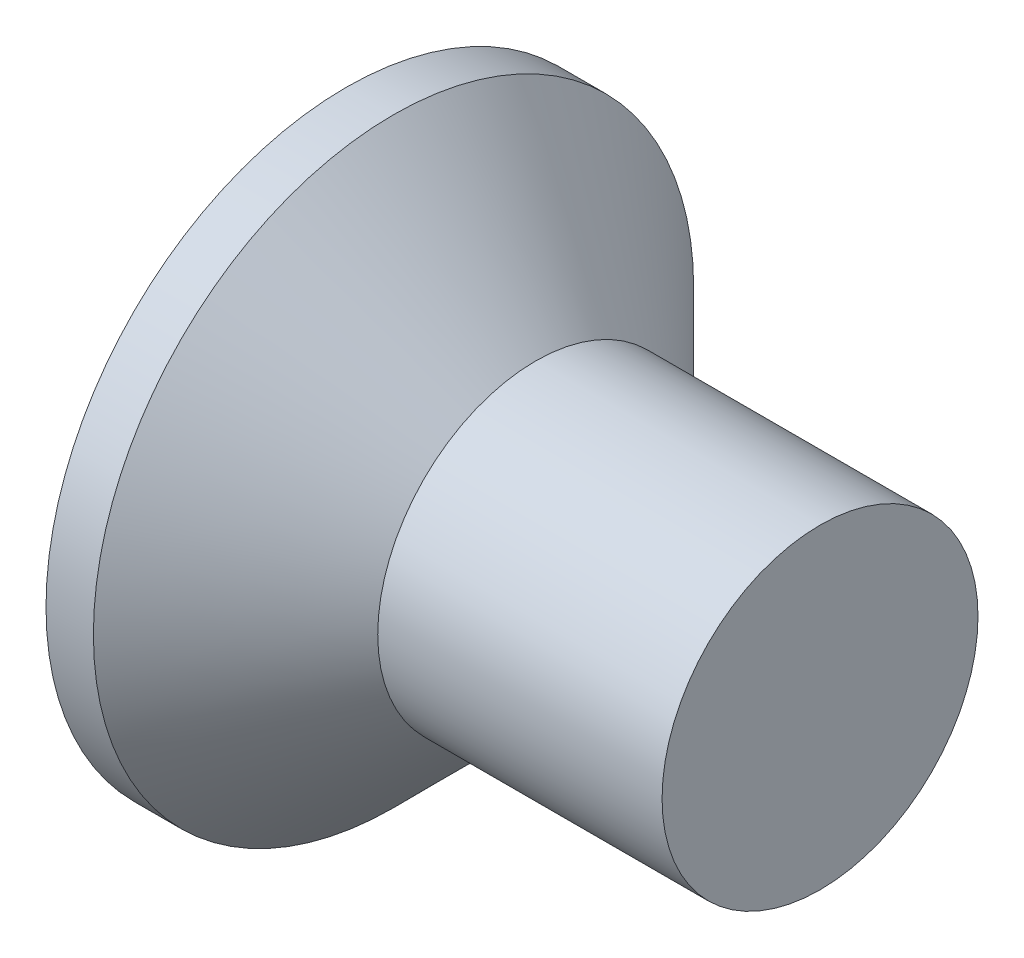
ISO-10303-21;
HEADER;
FILE_DESCRIPTION(('STEP AP214'),'2;1');
FILE_NAME('part.step','',(''),(''),'','','');
FILE_SCHEMA(('AUTOMOTIVE_DESIGN { 1 0 10303 214 1 1 1 1 }'));
ENDSEC;
DATA;
#1=APPLICATION_CONTEXT('core data for automotive mechanical design processes');
#2=APPLICATION_PROTOCOL_DEFINITION('international standard','automotive_design',2000,#1);
#3=PRODUCT_CONTEXT('',#1,'mechanical');
#4=PRODUCT('Part','Part','',(#3));
#5=PRODUCT_RELATED_PRODUCT_CATEGORY('part','',(#4));
#6=PRODUCT_DEFINITION_FORMATION('','',#4);
#7=PRODUCT_DEFINITION_CONTEXT('part definition',#1,'design');
#8=PRODUCT_DEFINITION('design','',#6,#7);
#9=PRODUCT_DEFINITION_SHAPE('','',#8);
#10=(LENGTH_UNIT() NAMED_UNIT(*) SI_UNIT(.MILLI.,.METRE.));
#11=(NAMED_UNIT(*) PLANE_ANGLE_UNIT() SI_UNIT($,.RADIAN.));
#12=(NAMED_UNIT(*) SI_UNIT($,.STERADIAN.) SOLID_ANGLE_UNIT());
#13=UNCERTAINTY_MEASURE_WITH_UNIT(LENGTH_MEASURE(1.E-05),#10,'distance_accuracy_value','');
#14=(GEOMETRIC_REPRESENTATION_CONTEXT(3) GLOBAL_UNCERTAINTY_ASSIGNED_CONTEXT((#13)) GLOBAL_UNIT_ASSIGNED_CONTEXT((#10,
#11,#12)) REPRESENTATION_CONTEXT('',''));
#15=CARTESIAN_POINT('',(0.,0.,0.));
#16=DIRECTION('',(0.,0.,1.));
#17=DIRECTION('',(1.,0.,0.));
#18=AXIS2_PLACEMENT_3D('',#15,#16,#17);
#19=CARTESIAN_POINT('',(0.,0.,0.));
#20=DIRECTION('',(-1.,0.,0.));
#21=DIRECTION('',(0.,0.,1.));
#22=AXIS2_PLACEMENT_3D('',#19,#20,#21);
#23=PLANE('',#22);
#24=CARTESIAN_POINT('',(0.,0.,0.));
#25=DIRECTION('',(-1.,0.,0.));
#26=DIRECTION('',(0.,0.,1.));
#27=AXIS2_PLACEMENT_3D('',#24,#25,#26);
#28=CIRCLE('',#27,1.9);
#29=CARTESIAN_POINT('',(0.,0.,1.9));
#30=VERTEX_POINT('',#29);
#31=EDGE_CURVE('E42',#30,#30,#28,.T.);
#32=ORIENTED_EDGE('',*,*,#31,.T.);
#33=EDGE_LOOP('',(#32));
#34=FACE_BOUND('',#33,.T.);
#35=DIRECTION('',(0.,1.,0.));
#36=VECTOR('',#35,1.);
#37=CARTESIAN_POINT('',(0.,-1.07,-0.264999999999999));
#38=LINE('',#37,#36);
#39=CARTESIAN_POINT('',(0.,-1.07,-0.264999999999999));
#40=VERTEX_POINT('',#39);
#41=CARTESIAN_POINT('',(0.,-0.264999999999999,-0.264999999999999));
#42=VERTEX_POINT('',#41);
#43=EDGE_CURVE('E103',#40,#42,#38,.T.);
#44=ORIENTED_EDGE('',*,*,#43,.T.);
#45=DIRECTION('',(0.,0.,-1.));
#46=VECTOR('',#45,1.);
#47=CARTESIAN_POINT('',(0.,-0.265000000000004,1.07));
#48=LINE('',#47,#46);
#49=CARTESIAN_POINT('',(0.,-0.264999999999996,-1.07));
#50=VERTEX_POINT('',#49);
#51=EDGE_CURVE('E83',#42,#50,#48,.T.);
#52=ORIENTED_EDGE('',*,*,#51,.T.);
#53=DIRECTION('',(0.,1.,0.));
#54=VECTOR('',#53,1.);
#55=CARTESIAN_POINT('',(0.,-0.264999999999996,-1.07));
#56=LINE('',#55,#54);
#57=CARTESIAN_POINT('',(0.,0.265000000000003,-1.07));
#58=VERTEX_POINT('',#57);
#59=EDGE_CURVE('E340',#50,#58,#56,.T.);
#60=ORIENTED_EDGE('',*,*,#59,.T.);
#61=DIRECTION('',(0.,0.,1.));
#62=VECTOR('',#61,1.);
#63=CARTESIAN_POINT('',(0.,0.265000000000003,-1.07));
#64=LINE('',#63,#62);
#65=CARTESIAN_POINT('',(0.,0.265,-0.264999999999999));
#66=VERTEX_POINT('',#65);
#67=EDGE_CURVE('E99',#58,#66,#64,.T.);
#68=ORIENTED_EDGE('',*,*,#67,.T.);
#69=CARTESIAN_POINT('',(0.,1.07,-0.264999999999999));
#70=VERTEX_POINT('',#69);
#71=EDGE_CURVE('E93',#66,#70,#38,.T.);
#72=ORIENTED_EDGE('',*,*,#71,.T.);
#73=DIRECTION('',(0.,0.,1.));
#74=VECTOR('',#73,1.);
#75=CARTESIAN_POINT('',(0.,1.07,-0.264999999999999));
#76=LINE('',#75,#74);
#77=CARTESIAN_POINT('',(0.,1.07,0.265));
#78=VERTEX_POINT('',#77);
#79=EDGE_CURVE('E96',#70,#78,#76,.T.);
#80=ORIENTED_EDGE('',*,*,#79,.T.);
#81=DIRECTION('',(0.,-1.,0.));
#82=VECTOR('',#81,1.);
#83=CARTESIAN_POINT('',(0.,1.07,0.265));
#84=LINE('',#83,#82);
#85=CARTESIAN_POINT('',(0.,0.264999999999998,0.265));
#86=VERTEX_POINT('',#85);
#87=EDGE_CURVE('E352',#78,#86,#84,.T.);
#88=ORIENTED_EDGE('',*,*,#87,.T.);
#89=CARTESIAN_POINT('',(0.,0.264999999999996,1.07));
#90=VERTEX_POINT('',#89);
#91=EDGE_CURVE('E335',#86,#90,#64,.T.);
#92=ORIENTED_EDGE('',*,*,#91,.T.);
#93=DIRECTION('',(0.,-1.,0.));
#94=VECTOR('',#93,1.);
#95=CARTESIAN_POINT('',(0.,0.264999999999996,1.07));
#96=LINE('',#95,#94);
#97=CARTESIAN_POINT('',(0.,-0.265000000000004,1.07));
#98=VERTEX_POINT('',#97);
#99=EDGE_CURVE('E321',#90,#98,#96,.T.);
#100=ORIENTED_EDGE('',*,*,#99,.T.);
#101=CARTESIAN_POINT('',(0.,-0.265000000000001,0.265));
#102=VERTEX_POINT('',#101);
#103=EDGE_CURVE('E333',#98,#102,#48,.T.);
#104=ORIENTED_EDGE('',*,*,#103,.T.);
#105=CARTESIAN_POINT('',(0.,-1.07,0.265));
#106=VERTEX_POINT('',#105);
#107=EDGE_CURVE('E109',#102,#106,#84,.T.);
#108=ORIENTED_EDGE('',*,*,#107,.T.);
#109=DIRECTION('',(0.,0.,-1.));
#110=VECTOR('',#109,1.);
#111=CARTESIAN_POINT('',(0.,-1.07,0.265));
#112=LINE('',#111,#110);
#113=EDGE_CURVE('E132',#106,#40,#112,.T.);
#114=ORIENTED_EDGE('',*,*,#113,.T.);
#115=EDGE_LOOP('',(#44,#52,#60,#68,#72,#80,#88,#92,#100,#104,#108,#114));
#116=FACE_BOUND('',#115,.T.);
#117=ADVANCED_FACE('F35',(#34,#116),#23,.T.);
#118=CARTESIAN_POINT('',(1.75765333333333,0.,0.113773333333333));
#119=DIRECTION('',(-0.0857222578731988,0.,-0.996319072639443));
#120=DIRECTION('',(-0.996319072639444,0.,0.0857222578731988));
#121=AXIS2_PLACEMENT_3D('',#118,#119,#120);
#122=PLANE('',#121);
#123=ORIENTED_EDGE('',*,*,#107,.F.);
#124=DIRECTION('',(0.992678495991953,0.0854090264408664,-0.0854090264408661));
#125=VECTOR('',#124,1.);
#126=CARTESIAN_POINT('',(1.76729945793969,-0.112943390794151,0.11294339079415));
#127=LINE('',#126,#125);
#128=CARTESIAN_POINT('',(1.54,-0.1325,0.1325));
#129=VERTEX_POINT('',#128);
#130=EDGE_CURVE('E127',#102,#129,#127,.T.);
#131=ORIENTED_EDGE('',*,*,#130,.T.);
#132=DIRECTION('',(0.851874354386278,0.518592342361777,-0.0732943843871311));
#133=VECTOR('',#132,1.);
#134=CARTESIAN_POINT('',(0.,-1.07,0.265));
#135=LINE('',#134,#133);
#136=EDGE_CURVE('E104',#106,#129,#135,.T.);
#137=ORIENTED_EDGE('',*,*,#136,.F.);
#138=EDGE_LOOP('',(#123,#131,#137));
#139=FACE_BOUND('',#138,.T.);
#140=ADVANCED_FACE('F155',(#139),#122,.T.);
#141=DIRECTION('',(0.851874354386278,-0.518592342361776,-0.0732943843871309));
#142=VECTOR('',#141,1.);
#143=CARTESIAN_POINT('',(0.,1.07,0.265));
#144=LINE('',#143,#142);
#145=CARTESIAN_POINT('',(1.54,0.1325,0.1325));
#146=VERTEX_POINT('',#145);
#147=EDGE_CURVE('E49',#78,#146,#144,.T.);
#148=ORIENTED_EDGE('',*,*,#147,.T.);
#149=DIRECTION('',(-0.992678495991953,0.0854090264408654,0.0854090264408661));
#150=VECTOR('',#149,1.);
#151=CARTESIAN_POINT('',(1.76729945793969,0.11294339079415,0.11294339079415));
#152=LINE('',#151,#150);
#153=EDGE_CURVE('E348',#146,#86,#152,.T.);
#154=ORIENTED_EDGE('',*,*,#153,.T.);
#155=ORIENTED_EDGE('',*,*,#87,.F.);
#156=EDGE_LOOP('',(#148,#154,#155));
#157=FACE_BOUND('',#156,.T.);
#158=ADVANCED_FACE('F159',(#157),#122,.T.);
#159=CARTESIAN_POINT('',(1.75765333333333,0.,-0.113773333333333));
#160=DIRECTION('',(-0.0857222578731985,0.,0.996319072639444));
#161=DIRECTION('',(0.996319072639444,0.,0.0857222578731985));
#162=AXIS2_PLACEMENT_3D('',#159,#160,#161);
#163=PLANE('',#162);
#164=DIRECTION('',(0.851874354386278,0.518592342361777,0.0732943843871307));
#165=VECTOR('',#164,1.);
#166=CARTESIAN_POINT('',(0.,-1.07,-0.264999999999999));
#167=LINE('',#166,#165);
#168=CARTESIAN_POINT('',(1.54,-0.1325,-0.1325));
#169=VERTEX_POINT('',#168);
#170=EDGE_CURVE('E58',#40,#169,#167,.T.);
#171=ORIENTED_EDGE('',*,*,#170,.T.);
#172=DIRECTION('',(-0.992678495991953,-0.0854090264408658,-0.0854090264408657));
#173=VECTOR('',#172,1.);
#174=CARTESIAN_POINT('',(1.76729945793969,-0.11294339079415,-0.11294339079415));
#175=LINE('',#174,#173);
#176=EDGE_CURVE('E11',#169,#42,#175,.T.);
#177=ORIENTED_EDGE('',*,*,#176,.T.);
#178=ORIENTED_EDGE('',*,*,#43,.F.);
#179=EDGE_LOOP('',(#171,#177,#178));
#180=FACE_BOUND('',#179,.T.);
#181=ADVANCED_FACE('F152',(#180),#163,.T.);
#182=ORIENTED_EDGE('',*,*,#71,.F.);
#183=DIRECTION('',(0.992678495991953,-0.0854090264408661,0.0854090264408657));
#184=VECTOR('',#183,1.);
#185=CARTESIAN_POINT('',(1.76729945793969,0.112943390794151,-0.11294339079415));
#186=LINE('',#185,#184);
#187=CARTESIAN_POINT('',(1.54,0.1325,-0.1325));
#188=VERTEX_POINT('',#187);
#189=EDGE_CURVE('E112',#66,#188,#186,.T.);
#190=ORIENTED_EDGE('',*,*,#189,.T.);
#191=DIRECTION('',(0.851874354386278,-0.518592342361776,0.0732943843871307));
#192=VECTOR('',#191,1.);
#193=CARTESIAN_POINT('',(0.,1.07,-0.264999999999999));
#194=LINE('',#193,#192);
#195=EDGE_CURVE('E108',#70,#188,#194,.T.);
#196=ORIENTED_EDGE('',*,*,#195,.F.);
#197=EDGE_LOOP('',(#182,#190,#196));
#198=FACE_BOUND('',#197,.T.);
#199=ADVANCED_FACE('F111',(#198),#163,.T.);
#200=CARTESIAN_POINT('',(-6.34999999999999,0.,0.));
#201=DIRECTION('',(-1.,0.,0.));
#202=DIRECTION('',(0.,0.,1.));
#203=AXIS2_PLACEMENT_3D('',#200,#201,#202);
#204=CYLINDRICAL_SURFACE('',#203,1.9);
#205=CARTESIAN_POINT('',(0.300000000000004,0.,0.));
#206=DIRECTION('',(-1.,0.,0.));
#207=DIRECTION('',(0.,0.,1.));
#208=AXIS2_PLACEMENT_3D('',#205,#206,#207);
#209=CIRCLE('',#208,1.9);
#210=CARTESIAN_POINT('',(0.300000000000004,0.,1.9));
#211=VERTEX_POINT('',#210);
#212=EDGE_CURVE('E135',#211,#211,#209,.T.);
#213=ORIENTED_EDGE('',*,*,#212,.T.);
#214=EDGE_LOOP('',(#213));
#215=FACE_BOUND('',#214,.T.);
#216=ORIENTED_EDGE('',*,*,#31,.F.);
#217=EDGE_LOOP('',(#216));
#218=FACE_BOUND('',#217,.T.);
#219=ADVANCED_FACE('F141',(#215,#218),#204,.T.);
#220=CARTESIAN_POINT('',(0.300000000000004,0.,0.));
#221=DIRECTION('',(-1.,0.,0.));
#222=DIRECTION('',(0.,0.,1.));
#223=AXIS2_PLACEMENT_3D('',#220,#221,#222);
#224=CONICAL_SURFACE('',#223,1.9,0.785398163397451);
#225=CARTESIAN_POINT('',(1.2,0.,0.));
#226=DIRECTION('',(-1.,0.,0.));
#227=DIRECTION('',(0.,0.,1.));
#228=AXIS2_PLACEMENT_3D('',#225,#226,#227);
#229=CIRCLE('',#228,1.);
#230=CARTESIAN_POINT('',(1.2,0.,1.));
#231=VERTEX_POINT('',#230);
#232=EDGE_CURVE('E131',#231,#231,#229,.T.);
#233=ORIENTED_EDGE('',*,*,#232,.T.);
#234=EDGE_LOOP('',(#233));
#235=FACE_BOUND('',#234,.T.);
#236=ORIENTED_EDGE('',*,*,#212,.F.);
#237=EDGE_LOOP('',(#236));
#238=FACE_BOUND('',#237,.T.);
#239=ADVANCED_FACE('F143',(#235,#238),#224,.T.);
#240=CARTESIAN_POINT('',(-6.34999999999999,0.,0.));
#241=DIRECTION('',(-1.,0.,0.));
#242=DIRECTION('',(0.,0.,1.));
#243=AXIS2_PLACEMENT_3D('',#240,#241,#242);
#244=CYLINDRICAL_SURFACE('',#243,1.);
#245=CARTESIAN_POINT('',(3.,0.,0.));
#246=DIRECTION('',(-1.,0.,0.));
#247=DIRECTION('',(0.,0.,1.));
#248=AXIS2_PLACEMENT_3D('',#245,#246,#247);
#249=CIRCLE('',#248,1.);
#250=CARTESIAN_POINT('',(3.,0.,1.));
#251=VERTEX_POINT('',#250);
#252=EDGE_CURVE('E128',#251,#251,#249,.T.);
#253=ORIENTED_EDGE('',*,*,#252,.T.);
#254=EDGE_LOOP('',(#253));
#255=FACE_BOUND('',#254,.T.);
#256=ORIENTED_EDGE('',*,*,#232,.F.);
#257=EDGE_LOOP('',(#256));
#258=FACE_BOUND('',#257,.T.);
#259=ADVANCED_FACE('F149',(#255,#258),#244,.T.);
#260=CARTESIAN_POINT('',(3.,1.,0.));
#261=DIRECTION('',(1.,0.,0.));
#262=DIRECTION('',(0.,0.,-1.));
#263=AXIS2_PLACEMENT_3D('',#260,#261,#262);
#264=PLANE('',#263);
#265=ORIENTED_EDGE('',*,*,#252,.F.);
#266=EDGE_LOOP('',(#265));
#267=FACE_BOUND('',#266,.T.);
#268=ADVANCED_FACE('F179',(#267),#264,.T.);
#269=CARTESIAN_POINT('',(1.54,0.1325,-0.1325));
#270=DIRECTION('',(1.,0.,0.));
#271=DIRECTION('',(0.,0.,-1.));
#272=AXIS2_PLACEMENT_3D('',#269,#270,#271);
#273=PLANE('',#272);
#274=DIRECTION('',(0.,1.,0.));
#275=VECTOR('',#274,1.);
#276=CARTESIAN_POINT('',(1.54,-0.1325,-0.1325));
#277=LINE('',#276,#275);
#278=EDGE_CURVE('E123',#169,#188,#277,.T.);
#279=ORIENTED_EDGE('',*,*,#278,.F.);
#280=DIRECTION('',(0.,0.,-1.));
#281=VECTOR('',#280,1.);
#282=CARTESIAN_POINT('',(1.54,-0.1325,0.1325));
#283=LINE('',#282,#281);
#284=EDGE_CURVE('E114',#129,#169,#283,.T.);
#285=ORIENTED_EDGE('',*,*,#284,.F.);
#286=DIRECTION('',(0.,-1.,0.));
#287=VECTOR('',#286,1.);
#288=CARTESIAN_POINT('',(1.54,0.1325,0.1325));
#289=LINE('',#288,#287);
#290=EDGE_CURVE('E117',#146,#129,#289,.T.);
#291=ORIENTED_EDGE('',*,*,#290,.F.);
#292=DIRECTION('',(0.,0.,1.));
#293=VECTOR('',#292,1.);
#294=CARTESIAN_POINT('',(1.54,0.1325,-0.1325));
#295=LINE('',#294,#293);
#296=EDGE_CURVE('E121',#188,#146,#295,.T.);
#297=ORIENTED_EDGE('',*,*,#296,.F.);
#298=EDGE_LOOP('',(#279,#285,#291,#297));
#299=FACE_BOUND('',#298,.T.);
#300=ADVANCED_FACE('F176',(#299),#273,.F.);
#301=CARTESIAN_POINT('',(1.54,-0.1325,-0.1325));
#302=DIRECTION('',(-0.519990936244093,0.854171777936963,0.));
#303=DIRECTION('',(-0.854171777936963,-0.519990936244093,0.));
#304=AXIS2_PLACEMENT_3D('',#301,#302,#303);
#305=PLANE('',#304);
#306=ORIENTED_EDGE('',*,*,#170,.F.);
#307=ORIENTED_EDGE('',*,*,#113,.F.);
#308=ORIENTED_EDGE('',*,*,#136,.T.);
#309=ORIENTED_EDGE('',*,*,#284,.T.);
#310=EDGE_LOOP('',(#306,#307,#308,#309));
#311=FACE_BOUND('',#310,.T.);
#312=ADVANCED_FACE('F168',(#311),#305,.T.);
#313=CARTESIAN_POINT('',(0.,1.07,0.265));
#314=DIRECTION('',(-0.519990936244092,-0.854171777936963,0.));
#315=DIRECTION('',(0.854171777936963,-0.519990936244092,0.));
#316=AXIS2_PLACEMENT_3D('',#313,#314,#315);
#317=PLANE('',#316);
#318=ORIENTED_EDGE('',*,*,#147,.F.);
#319=ORIENTED_EDGE('',*,*,#79,.F.);
#320=ORIENTED_EDGE('',*,*,#195,.T.);
#321=ORIENTED_EDGE('',*,*,#296,.T.);
#322=EDGE_LOOP('',(#318,#319,#320,#321));
#323=FACE_BOUND('',#322,.T.);
#324=ADVANCED_FACE('F107',(#323),#317,.T.);
#325=CARTESIAN_POINT('',(1.75765333333333,-0.113773333333333,0.));
#326=DIRECTION('',(-0.0857222578731988,0.996319072639443,0.));
#327=DIRECTION('',(-0.996319072639444,-0.0857222578731988,0.));
#328=AXIS2_PLACEMENT_3D('',#325,#326,#327);
#329=PLANE('',#328);
#330=DIRECTION('',(0.851874354386278,0.0732943843871293,0.518592342361777));
#331=VECTOR('',#330,1.);
#332=CARTESIAN_POINT('',(0.,-0.264999999999996,-1.07));
#333=LINE('',#332,#331);
#334=EDGE_CURVE('E342',#50,#169,#333,.T.);
#335=ORIENTED_EDGE('',*,*,#334,.F.);
#336=ORIENTED_EDGE('',*,*,#51,.F.);
#337=ORIENTED_EDGE('',*,*,#176,.F.);
#338=EDGE_LOOP('',(#335,#336,#337));
#339=FACE_BOUND('',#338,.T.);
#340=ADVANCED_FACE('F175',(#339),#329,.T.);
#341=CARTESIAN_POINT('',(1.75765333333333,0.113773333333333,0.));
#342=DIRECTION('',(-0.0857222578731985,-0.996319072639444,0.));
#343=DIRECTION('',(0.996319072639444,-0.0857222578731985,0.));
#344=AXIS2_PLACEMENT_3D('',#341,#342,#343);
#345=PLANE('',#344);
#346=ORIENTED_EDGE('',*,*,#67,.F.);
#347=DIRECTION('',(0.851874354386278,-0.0732943843871325,0.518592342361776));
#348=VECTOR('',#347,1.);
#349=CARTESIAN_POINT('',(0.,0.265000000000003,-1.07));
#350=LINE('',#349,#348);
#351=EDGE_CURVE('E74',#58,#188,#350,.T.);
#352=ORIENTED_EDGE('',*,*,#351,.T.);
#353=ORIENTED_EDGE('',*,*,#189,.F.);
#354=EDGE_LOOP('',(#346,#352,#353));
#355=FACE_BOUND('',#354,.T.);
#356=ADVANCED_FACE('F219',(#355),#345,.T.);
#357=CARTESIAN_POINT('',(1.54,0.1325,-0.1325));
#358=DIRECTION('',(-0.519990936244093,0.,0.854171777936963));
#359=DIRECTION('',(-0.854171777936963,0.,-0.519990936244093));
#360=AXIS2_PLACEMENT_3D('',#357,#358,#359);
#361=PLANE('',#360);
#362=ORIENTED_EDGE('',*,*,#351,.F.);
#363=ORIENTED_EDGE('',*,*,#59,.F.);
#364=ORIENTED_EDGE('',*,*,#334,.T.);
#365=ORIENTED_EDGE('',*,*,#278,.T.);
#366=EDGE_LOOP('',(#362,#363,#364,#365));
#367=FACE_BOUND('',#366,.T.);
#368=ADVANCED_FACE('F227',(#367),#361,.T.);
#369=ORIENTED_EDGE('',*,*,#103,.F.);
#370=DIRECTION('',(0.851874354386278,0.0732943843871327,-0.518592342361776));
#371=VECTOR('',#370,1.);
#372=CARTESIAN_POINT('',(0.,-0.265000000000004,1.07));
#373=LINE('',#372,#371);
#374=EDGE_CURVE('E318',#98,#129,#373,.T.);
#375=ORIENTED_EDGE('',*,*,#374,.T.);
#376=ORIENTED_EDGE('',*,*,#130,.F.);
#377=EDGE_LOOP('',(#369,#375,#376));
#378=FACE_BOUND('',#377,.T.);
#379=ADVANCED_FACE('F221',(#378),#329,.T.);
#380=DIRECTION('',(0.851874354386278,-0.0732943843871289,-0.518592342361776));
#381=VECTOR('',#380,1.);
#382=CARTESIAN_POINT('',(0.,0.264999999999996,1.07));
#383=LINE('',#382,#381);
#384=EDGE_CURVE('E329',#90,#146,#383,.T.);
#385=ORIENTED_EDGE('',*,*,#384,.F.);
#386=ORIENTED_EDGE('',*,*,#91,.F.);
#387=ORIENTED_EDGE('',*,*,#153,.F.);
#388=EDGE_LOOP('',(#385,#386,#387));
#389=FACE_BOUND('',#388,.T.);
#390=ADVANCED_FACE('F229',(#389),#345,.T.);
#391=CARTESIAN_POINT('',(0.,-0.265000000000004,1.07));
#392=DIRECTION('',(-0.519990936244092,0.,-0.854171777936963));
#393=DIRECTION('',(0.854171777936963,0.,-0.519990936244092));
#394=AXIS2_PLACEMENT_3D('',#391,#392,#393);
#395=PLANE('',#394);
#396=ORIENTED_EDGE('',*,*,#374,.F.);
#397=ORIENTED_EDGE('',*,*,#99,.F.);
#398=ORIENTED_EDGE('',*,*,#384,.T.);
#399=ORIENTED_EDGE('',*,*,#290,.T.);
#400=EDGE_LOOP('',(#396,#397,#398,#399));
#401=FACE_BOUND('',#400,.T.);
#402=ADVANCED_FACE('F248',(#401),#395,.T.);
#403=CLOSED_SHELL('',(#117,#140,#158,#181,#199,#219,#239,#259,#268,#300,#312,#324,#340,#356,
#368,#379,#390,#402));
#404=MANIFOLD_SOLID_BREP('B2',#403);
#405=ADVANCED_BREP_SHAPE_REPRESENTATION('',(#18,#404),#14);
#406=SHAPE_DEFINITION_REPRESENTATION(#9,#405);
ENDSEC;
END-ISO-10303-21;
